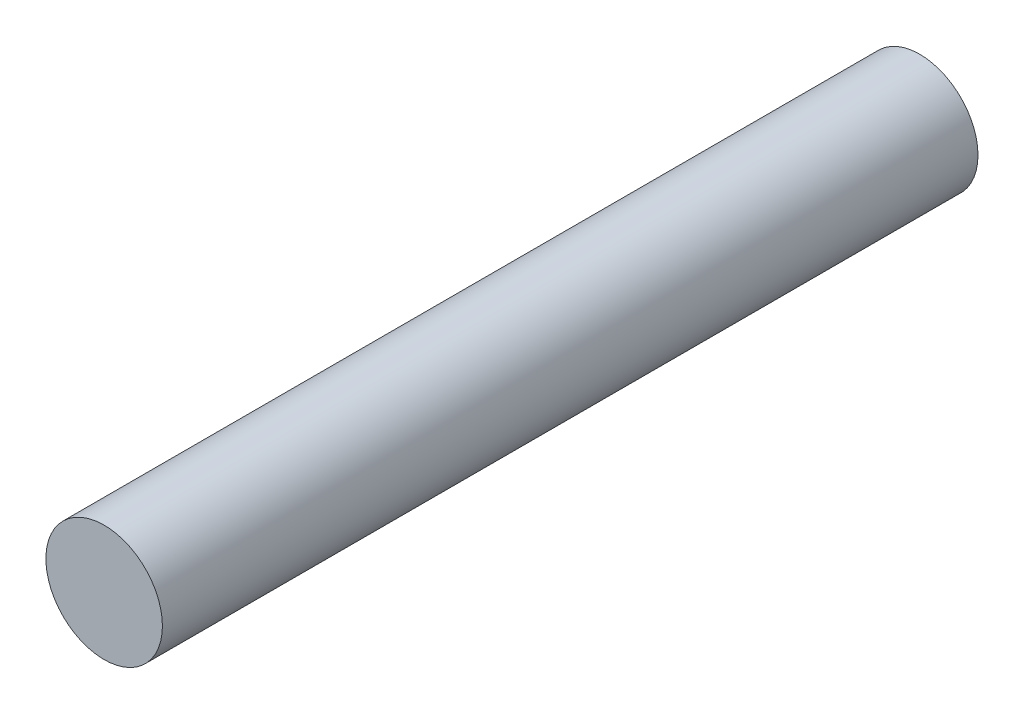
ISO-10303-21;
HEADER;
FILE_DESCRIPTION(('STEP AP214'),'2;1');
FILE_NAME('part.step','',(''),(''),'','','');
FILE_SCHEMA(('AUTOMOTIVE_DESIGN { 1 0 10303 214 1 1 1 1 }'));
ENDSEC;
DATA;
#1=APPLICATION_CONTEXT('core data for automotive mechanical design processes');
#2=APPLICATION_PROTOCOL_DEFINITION('international standard','automotive_design',2000,#1);
#3=PRODUCT_CONTEXT('',#1,'mechanical');
#4=PRODUCT('Part','Part','',(#3));
#5=PRODUCT_RELATED_PRODUCT_CATEGORY('part','',(#4));
#6=PRODUCT_DEFINITION_FORMATION('','',#4);
#7=PRODUCT_DEFINITION_CONTEXT('part definition',#1,'design');
#8=PRODUCT_DEFINITION('design','',#6,#7);
#9=PRODUCT_DEFINITION_SHAPE('','',#8);
#10=(LENGTH_UNIT() NAMED_UNIT(*) SI_UNIT(.MILLI.,.METRE.));
#11=(NAMED_UNIT(*) PLANE_ANGLE_UNIT() SI_UNIT($,.RADIAN.));
#12=(NAMED_UNIT(*) SI_UNIT($,.STERADIAN.) SOLID_ANGLE_UNIT());
#13=UNCERTAINTY_MEASURE_WITH_UNIT(LENGTH_MEASURE(1.E-05),#10,'distance_accuracy_value','');
#14=(GEOMETRIC_REPRESENTATION_CONTEXT(3) GLOBAL_UNCERTAINTY_ASSIGNED_CONTEXT((#13)) GLOBAL_UNIT_ASSIGNED_CONTEXT((#10,
#11,#12)) REPRESENTATION_CONTEXT('',''));
#15=CARTESIAN_POINT('',(0.,0.,0.));
#16=DIRECTION('',(0.,0.,1.));
#17=DIRECTION('',(1.,0.,0.));
#18=AXIS2_PLACEMENT_3D('',#15,#16,#17);
#19=CARTESIAN_POINT('',(0.,0.,14.));
#20=DIRECTION('',(0.,0.,-1.));
#21=DIRECTION('',(-1.,0.,0.));
#22=AXIS2_PLACEMENT_3D('',#19,#20,#21);
#23=CYLINDRICAL_SURFACE('',#22,1.);
#24=CARTESIAN_POINT('',(0.,0.,14.));
#25=DIRECTION('',(0.,0.,1.));
#26=DIRECTION('',(1.,0.,0.));
#27=AXIS2_PLACEMENT_3D('',#24,#25,#26);
#28=CIRCLE('',#27,1.);
#29=CARTESIAN_POINT('',(1.,0.,14.));
#30=VERTEX_POINT('',#29);
#31=EDGE_CURVE('E10',#30,#30,#28,.T.);
#32=ORIENTED_EDGE('',*,*,#31,.F.);
#33=EDGE_LOOP('',(#32));
#34=FACE_BOUND('',#33,.T.);
#35=CARTESIAN_POINT('',(0.,0.,0.));
#36=DIRECTION('',(0.,0.,1.));
#37=DIRECTION('',(1.,0.,0.));
#38=AXIS2_PLACEMENT_3D('',#35,#36,#37);
#39=CIRCLE('',#38,1.);
#40=CARTESIAN_POINT('',(1.,0.,0.));
#41=VERTEX_POINT('',#40);
#42=EDGE_CURVE('E36',#41,#41,#39,.T.);
#43=ORIENTED_EDGE('',*,*,#42,.T.);
#44=EDGE_LOOP('',(#43));
#45=FACE_BOUND('',#44,.T.);
#46=ADVANCED_FACE('F33',(#34,#45),#23,.T.);
#47=CARTESIAN_POINT('',(0.,0.,14.));
#48=DIRECTION('',(0.,0.,1.));
#49=DIRECTION('',(1.,0.,0.));
#50=AXIS2_PLACEMENT_3D('',#47,#48,#49);
#51=PLANE('',#50);
#52=ORIENTED_EDGE('',*,*,#31,.T.);
#53=EDGE_LOOP('',(#52));
#54=FACE_BOUND('',#53,.T.);
#55=ADVANCED_FACE('F48',(#54),#51,.T.);
#56=CARTESIAN_POINT('',(0.,0.,0.));
#57=DIRECTION('',(0.,0.,1.));
#58=DIRECTION('',(1.,0.,0.));
#59=AXIS2_PLACEMENT_3D('',#56,#57,#58);
#60=PLANE('',#59);
#61=ORIENTED_EDGE('',*,*,#42,.F.);
#62=EDGE_LOOP('',(#61));
#63=FACE_BOUND('',#62,.T.);
#64=ADVANCED_FACE('F46',(#63),#60,.F.);
#65=CLOSED_SHELL('',(#46,#55,#64));
#66=MANIFOLD_SOLID_BREP('B2',#65);
#67=ADVANCED_BREP_SHAPE_REPRESENTATION('',(#18,#66),#14);
#68=SHAPE_DEFINITION_REPRESENTATION(#9,#67);
ENDSEC;
END-ISO-10303-21;
